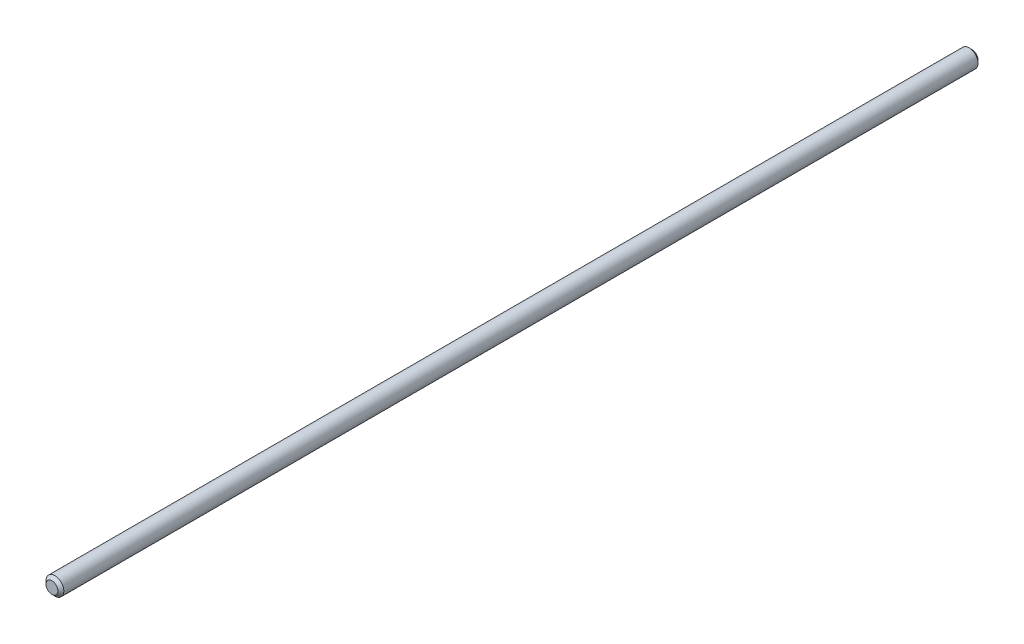
ISO-10303-21;
HEADER;
FILE_DESCRIPTION(('STEP AP214'),'2;1');
FILE_NAME('part.step','',(''),(''),'','','');
FILE_SCHEMA(('AUTOMOTIVE_DESIGN { 1 0 10303 214 1 1 1 1 }'));
ENDSEC;
DATA;
#1=APPLICATION_CONTEXT('core data for automotive mechanical design processes');
#2=APPLICATION_PROTOCOL_DEFINITION('international standard','automotive_design',2000,#1);
#3=PRODUCT_CONTEXT('',#1,'mechanical');
#4=PRODUCT('Part','Part','',(#3));
#5=PRODUCT_RELATED_PRODUCT_CATEGORY('part','',(#4));
#6=PRODUCT_DEFINITION_FORMATION('','',#4);
#7=PRODUCT_DEFINITION_CONTEXT('part definition',#1,'design');
#8=PRODUCT_DEFINITION('design','',#6,#7);
#9=PRODUCT_DEFINITION_SHAPE('','',#8);
#10=(LENGTH_UNIT() NAMED_UNIT(*) SI_UNIT(.MILLI.,.METRE.));
#11=(NAMED_UNIT(*) PLANE_ANGLE_UNIT() SI_UNIT($,.RADIAN.));
#12=(NAMED_UNIT(*) SI_UNIT($,.STERADIAN.) SOLID_ANGLE_UNIT());
#13=UNCERTAINTY_MEASURE_WITH_UNIT(LENGTH_MEASURE(1.E-05),#10,'distance_accuracy_value','');
#14=(GEOMETRIC_REPRESENTATION_CONTEXT(3) GLOBAL_UNCERTAINTY_ASSIGNED_CONTEXT((#13)) GLOBAL_UNIT_ASSIGNED_CONTEXT((#10,
#11,#12)) REPRESENTATION_CONTEXT('',''));
#15=CARTESIAN_POINT('',(0.,0.,0.));
#16=DIRECTION('',(0.,0.,1.));
#17=DIRECTION('',(1.,0.,0.));
#18=AXIS2_PLACEMENT_3D('',#15,#16,#17);
#19=CARTESIAN_POINT('',(0.,0.,155.));
#20=DIRECTION('',(0.,0.,-1.));
#21=DIRECTION('',(-1.,0.,0.));
#22=AXIS2_PLACEMENT_3D('',#19,#20,#21);
#23=CYLINDRICAL_SURFACE('',#22,1.5);
#24=CARTESIAN_POINT('',(0.,0.,0.499999999999973));
#25=DIRECTION('',(0.,0.,1.));
#26=DIRECTION('',(1.,0.,0.));
#27=AXIS2_PLACEMENT_3D('',#24,#25,#26);
#28=CIRCLE('',#27,1.5);
#29=CARTESIAN_POINT('',(1.5,0.,0.499999999999973));
#30=VERTEX_POINT('',#29);
#31=EDGE_CURVE('E47',#30,#30,#28,.T.);
#32=ORIENTED_EDGE('',*,*,#31,.T.);
#33=EDGE_LOOP('',(#32));
#34=FACE_BOUND('',#33,.T.);
#35=CARTESIAN_POINT('',(0.,0.,154.5));
#36=DIRECTION('',(0.,0.,1.));
#37=DIRECTION('',(1.,0.,0.));
#38=AXIS2_PLACEMENT_3D('',#35,#36,#37);
#39=CIRCLE('',#38,1.5);
#40=CARTESIAN_POINT('',(1.5,0.,154.5));
#41=VERTEX_POINT('',#40);
#42=EDGE_CURVE('E51',#41,#41,#39,.F.);
#43=ORIENTED_EDGE('',*,*,#42,.T.);
#44=EDGE_LOOP('',(#43));
#45=FACE_BOUND('',#44,.T.);
#46=ADVANCED_FACE('F35',(#34,#45),#23,.T.);
#47=CARTESIAN_POINT('',(0.,0.,155.));
#48=DIRECTION('',(0.,0.,1.));
#49=DIRECTION('',(1.,0.,0.));
#50=AXIS2_PLACEMENT_3D('',#47,#48,#49);
#51=PLANE('',#50);
#52=CARTESIAN_POINT('',(0.,0.,155.));
#53=DIRECTION('',(0.,0.,1.));
#54=DIRECTION('',(1.,0.,0.));
#55=AXIS2_PLACEMENT_3D('',#52,#53,#54);
#56=CIRCLE('',#55,1.00000000000001);
#57=CARTESIAN_POINT('',(1.00000000000001,0.,155.));
#58=VERTEX_POINT('',#57);
#59=EDGE_CURVE('E10',#58,#58,#56,.T.);
#60=ORIENTED_EDGE('',*,*,#59,.T.);
#61=EDGE_LOOP('',(#60));
#62=FACE_BOUND('',#61,.T.);
#63=ADVANCED_FACE('F67',(#62),#51,.T.);
#64=CARTESIAN_POINT('',(0.,0.,0.));
#65=DIRECTION('',(0.,0.,1.));
#66=DIRECTION('',(1.,0.,0.));
#67=AXIS2_PLACEMENT_3D('',#64,#65,#66);
#68=PLANE('',#67);
#69=CARTESIAN_POINT('',(0.,0.,0.));
#70=DIRECTION('',(0.,0.,1.));
#71=DIRECTION('',(1.,0.,0.));
#72=AXIS2_PLACEMENT_3D('',#69,#70,#71);
#73=CIRCLE('',#72,1.00000000000001);
#74=CARTESIAN_POINT('',(1.00000000000001,0.,0.));
#75=VERTEX_POINT('',#74);
#76=EDGE_CURVE('E43',#75,#75,#73,.F.);
#77=ORIENTED_EDGE('',*,*,#76,.T.);
#78=EDGE_LOOP('',(#77));
#79=FACE_BOUND('',#78,.T.);
#80=ADVANCED_FACE('F64',(#79),#68,.F.);
#81=CARTESIAN_POINT('',(0.,0.,0.499999999999973));
#82=DIRECTION('',(0.,0.,1.));
#83=DIRECTION('',(1.,0.,0.));
#84=AXIS2_PLACEMENT_3D('',#81,#82,#83);
#85=CONICAL_SURFACE('',#84,1.5,0.785398163397461);
#86=ORIENTED_EDGE('',*,*,#76,.F.);
#87=EDGE_LOOP('',(#86));
#88=FACE_BOUND('',#87,.T.);
#89=ORIENTED_EDGE('',*,*,#31,.F.);
#90=EDGE_LOOP('',(#89));
#91=FACE_BOUND('',#90,.T.);
#92=ADVANCED_FACE('F60',(#88,#91),#85,.T.);
#93=CARTESIAN_POINT('',(0.,0.,155.));
#94=DIRECTION('',(0.,0.,-1.));
#95=DIRECTION('',(-1.,0.,0.));
#96=AXIS2_PLACEMENT_3D('',#93,#94,#95);
#97=CONICAL_SURFACE('',#96,1.00000000000001,0.785398163397461);
#98=ORIENTED_EDGE('',*,*,#42,.F.);
#99=EDGE_LOOP('',(#98));
#100=FACE_BOUND('',#99,.T.);
#101=ORIENTED_EDGE('',*,*,#59,.F.);
#102=EDGE_LOOP('',(#101));
#103=FACE_BOUND('',#102,.T.);
#104=ADVANCED_FACE('F38',(#100,#103),#97,.T.);
#105=CLOSED_SHELL('',(#46,#63,#80,#92,#104));
#106=MANIFOLD_SOLID_BREP('B2',#105);
#107=ADVANCED_BREP_SHAPE_REPRESENTATION('',(#18,#106),#14);
#108=SHAPE_DEFINITION_REPRESENTATION(#9,#107);
ENDSEC;
END-ISO-10303-21;
